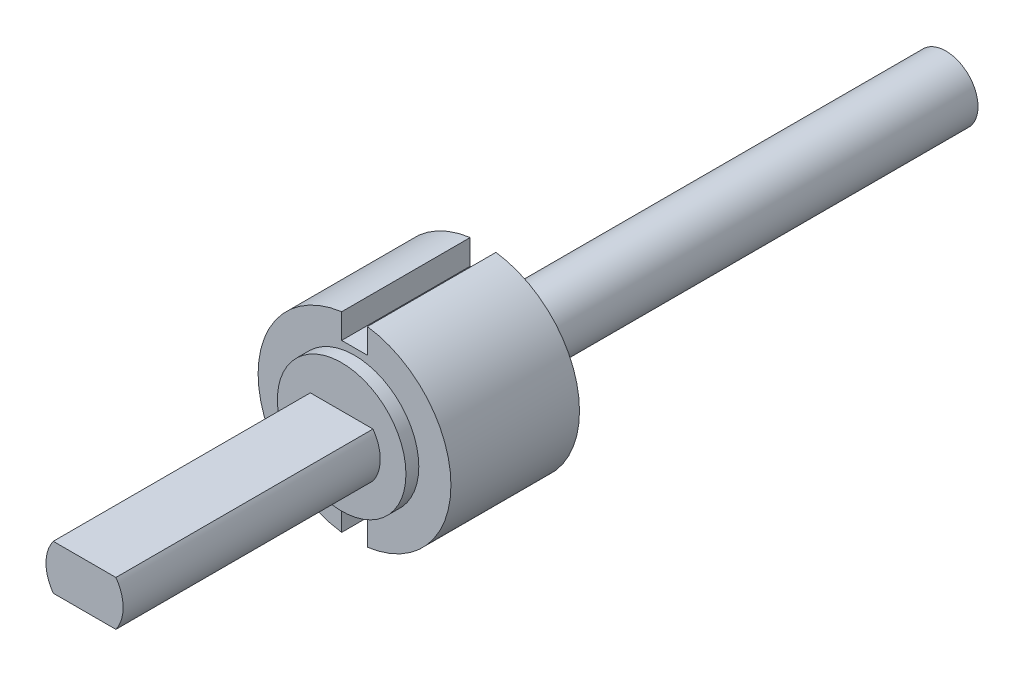
ISO-10303-21;
HEADER;
FILE_DESCRIPTION(('STEP AP214'),'2;1');
FILE_NAME('part.step','',(''),(''),'','','');
FILE_SCHEMA(('AUTOMOTIVE_DESIGN { 1 0 10303 214 1 1 1 1 }'));
ENDSEC;
DATA;
#1=APPLICATION_CONTEXT('core data for automotive mechanical design processes');
#2=APPLICATION_PROTOCOL_DEFINITION('international standard','automotive_design',2000,#1);
#3=PRODUCT_CONTEXT('',#1,'mechanical');
#4=PRODUCT('Part','Part','',(#3));
#5=PRODUCT_RELATED_PRODUCT_CATEGORY('part','',(#4));
#6=PRODUCT_DEFINITION_FORMATION('','',#4);
#7=PRODUCT_DEFINITION_CONTEXT('part definition',#1,'design');
#8=PRODUCT_DEFINITION('design','',#6,#7);
#9=PRODUCT_DEFINITION_SHAPE('','',#8);
#10=(LENGTH_UNIT() NAMED_UNIT(*) SI_UNIT(.MILLI.,.METRE.));
#11=(NAMED_UNIT(*) PLANE_ANGLE_UNIT() SI_UNIT($,.RADIAN.));
#12=(NAMED_UNIT(*) SI_UNIT($,.STERADIAN.) SOLID_ANGLE_UNIT());
#13=UNCERTAINTY_MEASURE_WITH_UNIT(LENGTH_MEASURE(1.E-05),#10,'distance_accuracy_value','');
#14=(GEOMETRIC_REPRESENTATION_CONTEXT(3) GLOBAL_UNCERTAINTY_ASSIGNED_CONTEXT((#13)) GLOBAL_UNIT_ASSIGNED_CONTEXT((#10,
#11,#12)) REPRESENTATION_CONTEXT('',''));
#15=CARTESIAN_POINT('',(0.,0.,0.));
#16=DIRECTION('',(0.,0.,1.));
#17=DIRECTION('',(1.,0.,0.));
#18=AXIS2_PLACEMENT_3D('',#15,#16,#17);
#19=CARTESIAN_POINT('',(0.,0.,5.));
#20=DIRECTION('',(0.,0.,-1.));
#21=DIRECTION('',(-1.,0.,0.));
#22=AXIS2_PLACEMENT_3D('',#19,#20,#21);
#23=CYLINDRICAL_SURFACE('',#22,7.5);
#24=CARTESIAN_POINT('',(0.,0.,5.));
#25=DIRECTION('',(0.,0.,1.));
#26=DIRECTION('',(1.,0.,0.));
#27=AXIS2_PLACEMENT_3D('',#24,#25,#26);
#28=CIRCLE('',#27,7.5);
#29=CARTESIAN_POINT('',(1.,-7.43303437365925,5.));
#30=VERTEX_POINT('',#29);
#31=CARTESIAN_POINT('',(1.,7.43303437365925,5.));
#32=VERTEX_POINT('',#31);
#33=EDGE_CURVE('E152',#30,#32,#28,.T.);
#34=ORIENTED_EDGE('',*,*,#33,.F.);
#35=DIRECTION('',(0.,0.,-1.));
#36=VECTOR('',#35,1.);
#37=CARTESIAN_POINT('',(1.,-7.43303437365925,5.));
#38=LINE('',#37,#36);
#39=CARTESIAN_POINT('',(1.,-7.43303437365925,-5.));
#40=VERTEX_POINT('',#39);
#41=EDGE_CURVE('E233',#30,#40,#38,.T.);
#42=ORIENTED_EDGE('',*,*,#41,.T.);
#43=CARTESIAN_POINT('',(0.,0.,-5.));
#44=DIRECTION('',(0.,0.,1.));
#45=DIRECTION('',(1.,0.,0.));
#46=AXIS2_PLACEMENT_3D('',#43,#44,#45);
#47=CIRCLE('',#46,7.5);
#48=CARTESIAN_POINT('',(1.,7.43303437365925,-5.));
#49=VERTEX_POINT('',#48);
#50=EDGE_CURVE('E144',#40,#49,#47,.T.);
#51=ORIENTED_EDGE('',*,*,#50,.T.);
#52=DIRECTION('',(0.,0.,-1.));
#53=VECTOR('',#52,1.);
#54=CARTESIAN_POINT('',(1.,7.43303437365925,5.));
#55=LINE('',#54,#53);
#56=EDGE_CURVE('E178',#49,#32,#55,.F.);
#57=ORIENTED_EDGE('',*,*,#56,.T.);
#58=EDGE_LOOP('',(#34,#42,#51,#57));
#59=FACE_BOUND('',#58,.T.);
#60=ADVANCED_FACE('F35',(#59),#23,.T.);
#61=CARTESIAN_POINT('',(0.,0.,6.));
#62=DIRECTION('',(0.,0.,1.));
#63=DIRECTION('',(1.,0.,0.));
#64=AXIS2_PLACEMENT_3D('',#61,#62,#63);
#65=PLANE('',#64);
#66=CARTESIAN_POINT('',(0.,0.,6.));
#67=DIRECTION('',(0.,0.,1.));
#68=DIRECTION('',(1.,0.,0.));
#69=AXIS2_PLACEMENT_3D('',#66,#67,#68);
#70=CIRCLE('',#69,5.);
#71=CARTESIAN_POINT('',(5.,0.,6.));
#72=VERTEX_POINT('',#71);
#73=EDGE_CURVE('E149',#72,#72,#70,.T.);
#74=ORIENTED_EDGE('',*,*,#73,.T.);
#75=EDGE_LOOP('',(#74));
#76=FACE_BOUND('',#75,.T.);
#77=DIRECTION('',(1.,0.,0.));
#78=VECTOR('',#77,1.);
#79=CARTESIAN_POINT('',(0.,1.75,6.));
#80=LINE('',#79,#78);
#81=CARTESIAN_POINT('',(-2.43669858620224,1.75,6.));
#82=VERTEX_POINT('',#81);
#83=CARTESIAN_POINT('',(2.43669858620224,1.75,6.));
#84=VERTEX_POINT('',#83);
#85=EDGE_CURVE('E181',#82,#84,#80,.T.);
#86=ORIENTED_EDGE('',*,*,#85,.T.);
#87=CARTESIAN_POINT('',(0.,0.,6.));
#88=DIRECTION('',(0.,0.,1.));
#89=DIRECTION('',(1.,0.,0.));
#90=AXIS2_PLACEMENT_3D('',#87,#88,#89);
#91=CIRCLE('',#90,3.);
#92=CARTESIAN_POINT('',(2.43669858620224,-1.75,6.));
#93=VERTEX_POINT('',#92);
#94=EDGE_CURVE('E191',#93,#84,#91,.T.);
#95=ORIENTED_EDGE('',*,*,#94,.F.);
#96=DIRECTION('',(1.,0.,0.));
#97=VECTOR('',#96,1.);
#98=CARTESIAN_POINT('',(0.,-1.75,6.));
#99=LINE('',#98,#97);
#100=CARTESIAN_POINT('',(-2.43669858620224,-1.75,6.));
#101=VERTEX_POINT('',#100);
#102=EDGE_CURVE('E200',#101,#93,#99,.T.);
#103=ORIENTED_EDGE('',*,*,#102,.F.);
#104=EDGE_CURVE('E198',#82,#101,#91,.T.);
#105=ORIENTED_EDGE('',*,*,#104,.F.);
#106=EDGE_LOOP('',(#86,#95,#103,#105));
#107=FACE_BOUND('',#106,.T.);
#108=ADVANCED_FACE('F224',(#76,#107),#65,.T.);
#109=CARTESIAN_POINT('',(-1.,7.43303437365925,-5.));
#110=VERTEX_POINT('',#109);
#111=CARTESIAN_POINT('',(-0.999999999999999,-7.43303437365925,-5.));
#112=VERTEX_POINT('',#111);
#113=EDGE_CURVE('E148',#110,#112,#47,.T.);
#114=ORIENTED_EDGE('',*,*,#113,.T.);
#115=DIRECTION('',(0.,0.,-1.));
#116=VECTOR('',#115,1.);
#117=CARTESIAN_POINT('',(-0.999999999999999,-7.43303437365925,5.));
#118=LINE('',#117,#116);
#119=CARTESIAN_POINT('',(-0.999999999999999,-7.43303437365925,5.));
#120=VERTEX_POINT('',#119);
#121=EDGE_CURVE('E244',#112,#120,#118,.F.);
#122=ORIENTED_EDGE('',*,*,#121,.T.);
#123=CARTESIAN_POINT('',(-1.,7.43303437365925,5.));
#124=VERTEX_POINT('',#123);
#125=EDGE_CURVE('E158',#124,#120,#28,.T.);
#126=ORIENTED_EDGE('',*,*,#125,.F.);
#127=DIRECTION('',(0.,0.,-1.));
#128=VECTOR('',#127,1.);
#129=CARTESIAN_POINT('',(-1.,7.43303437365925,5.));
#130=LINE('',#129,#128);
#131=EDGE_CURVE('E169',#124,#110,#130,.T.);
#132=ORIENTED_EDGE('',*,*,#131,.T.);
#133=EDGE_LOOP('',(#114,#122,#126,#132));
#134=FACE_BOUND('',#133,.T.);
#135=ADVANCED_FACE('F37',(#134),#23,.T.);
#136=CARTESIAN_POINT('',(0.,0.,5.));
#137=DIRECTION('',(0.,0.,1.));
#138=DIRECTION('',(1.,0.,0.));
#139=AXIS2_PLACEMENT_3D('',#136,#137,#138);
#140=PLANE('',#139);
#141=DIRECTION('',(0.,1.,0.));
#142=VECTOR('',#141,1.);
#143=CARTESIAN_POINT('',(1.,-7.5,5.));
#144=LINE('',#143,#142);
#145=CARTESIAN_POINT('',(1.,-5.5,5.));
#146=VERTEX_POINT('',#145);
#147=EDGE_CURVE('E129',#30,#146,#144,.T.);
#148=ORIENTED_EDGE('',*,*,#147,.F.);
#149=ORIENTED_EDGE('',*,*,#33,.T.);
#150=DIRECTION('',(0.,1.,0.));
#151=VECTOR('',#150,1.);
#152=CARTESIAN_POINT('',(1.,7.5,5.));
#153=LINE('',#152,#151);
#154=CARTESIAN_POINT('',(0.999999999999999,5.5,5.));
#155=VERTEX_POINT('',#154);
#156=EDGE_CURVE('E242',#155,#32,#153,.T.);
#157=ORIENTED_EDGE('',*,*,#156,.F.);
#158=DIRECTION('',(1.,0.,0.));
#159=VECTOR('',#158,1.);
#160=CARTESIAN_POINT('',(-1.,5.5,5.));
#161=LINE('',#160,#159);
#162=CARTESIAN_POINT('',(-1.,5.5,5.));
#163=VERTEX_POINT('',#162);
#164=EDGE_CURVE('E240',#163,#155,#161,.T.);
#165=ORIENTED_EDGE('',*,*,#164,.F.);
#166=DIRECTION('',(0.,-1.,0.));
#167=VECTOR('',#166,1.);
#168=CARTESIAN_POINT('',(-1.,7.5,5.));
#169=LINE('',#168,#167);
#170=EDGE_CURVE('E238',#124,#163,#169,.T.);
#171=ORIENTED_EDGE('',*,*,#170,.F.);
#172=ORIENTED_EDGE('',*,*,#125,.T.);
#173=DIRECTION('',(0.,-1.,0.));
#174=VECTOR('',#173,1.);
#175=CARTESIAN_POINT('',(-0.999999999999999,-7.5,5.));
#176=LINE('',#175,#174);
#177=CARTESIAN_POINT('',(-0.999999999999999,-5.5,5.));
#178=VERTEX_POINT('',#177);
#179=EDGE_CURVE('E139',#178,#120,#176,.T.);
#180=ORIENTED_EDGE('',*,*,#179,.F.);
#181=DIRECTION('',(-1.,0.,0.));
#182=VECTOR('',#181,1.);
#183=CARTESIAN_POINT('',(1.,-5.5,5.));
#184=LINE('',#183,#182);
#185=EDGE_CURVE('E255',#146,#178,#184,.T.);
#186=ORIENTED_EDGE('',*,*,#185,.F.);
#187=EDGE_LOOP('',(#148,#149,#157,#165,#171,#172,#180,#186));
#188=FACE_BOUND('',#187,.T.);
#189=CARTESIAN_POINT('',(0.,0.,5.));
#190=DIRECTION('',(0.,0.,1.));
#191=DIRECTION('',(1.,0.,0.));
#192=AXIS2_PLACEMENT_3D('',#189,#190,#191);
#193=CIRCLE('',#192,5.);
#194=CARTESIAN_POINT('',(5.,0.,5.));
#195=VERTEX_POINT('',#194);
#196=EDGE_CURVE('E154',#195,#195,#193,.T.);
#197=ORIENTED_EDGE('',*,*,#196,.F.);
#198=EDGE_LOOP('',(#197));
#199=FACE_BOUND('',#198,.T.);
#200=ADVANCED_FACE('F216',(#188,#199),#140,.T.);
#201=CARTESIAN_POINT('',(0.,0.,-5.));
#202=DIRECTION('',(0.,0.,1.));
#203=DIRECTION('',(1.,0.,0.));
#204=AXIS2_PLACEMENT_3D('',#201,#202,#203);
#205=PLANE('',#204);
#206=ORIENTED_EDGE('',*,*,#50,.F.);
#207=DIRECTION('',(0.,1.,0.));
#208=VECTOR('',#207,1.);
#209=CARTESIAN_POINT('',(1.,0.,-5.));
#210=LINE('',#209,#208);
#211=CARTESIAN_POINT('',(1.,-5.5,-5.));
#212=VERTEX_POINT('',#211);
#213=EDGE_CURVE('E11',#40,#212,#210,.T.);
#214=ORIENTED_EDGE('',*,*,#213,.T.);
#215=DIRECTION('',(-1.,0.,0.));
#216=VECTOR('',#215,1.);
#217=CARTESIAN_POINT('',(1.,-5.5,-5.));
#218=LINE('',#217,#216);
#219=CARTESIAN_POINT('',(-0.999999999999999,-5.5,-5.));
#220=VERTEX_POINT('',#219);
#221=EDGE_CURVE('E136',#212,#220,#218,.T.);
#222=ORIENTED_EDGE('',*,*,#221,.T.);
#223=DIRECTION('',(0.,-1.,0.));
#224=VECTOR('',#223,1.);
#225=CARTESIAN_POINT('',(-0.999999999999999,-7.5,-5.));
#226=LINE('',#225,#224);
#227=EDGE_CURVE('E50',#220,#112,#226,.T.);
#228=ORIENTED_EDGE('',*,*,#227,.T.);
#229=ORIENTED_EDGE('',*,*,#113,.F.);
#230=DIRECTION('',(0.,-1.,0.));
#231=VECTOR('',#230,1.);
#232=CARTESIAN_POINT('',(-1.,0.,-5.));
#233=LINE('',#232,#231);
#234=CARTESIAN_POINT('',(-1.,5.5,-5.));
#235=VERTEX_POINT('',#234);
#236=EDGE_CURVE('E43',#110,#235,#233,.T.);
#237=ORIENTED_EDGE('',*,*,#236,.T.);
#238=DIRECTION('',(1.,0.,0.));
#239=VECTOR('',#238,1.);
#240=CARTESIAN_POINT('',(-1.,5.5,-5.));
#241=LINE('',#240,#239);
#242=CARTESIAN_POINT('',(0.999999999999999,5.5,-5.));
#243=VERTEX_POINT('',#242);
#244=EDGE_CURVE('E165',#235,#243,#241,.T.);
#245=ORIENTED_EDGE('',*,*,#244,.T.);
#246=DIRECTION('',(0.,1.,0.));
#247=VECTOR('',#246,1.);
#248=CARTESIAN_POINT('',(1.,7.5,-5.));
#249=LINE('',#248,#247);
#250=EDGE_CURVE('E58',#243,#49,#249,.T.);
#251=ORIENTED_EDGE('',*,*,#250,.T.);
#252=EDGE_LOOP('',(#206,#214,#222,#228,#229,#237,#245,#251));
#253=FACE_BOUND('',#252,.T.);
#254=CARTESIAN_POINT('',(0.,0.,-5.));
#255=DIRECTION('',(0.,0.,1.));
#256=DIRECTION('',(1.,0.,0.));
#257=AXIS2_PLACEMENT_3D('',#254,#255,#256);
#258=CIRCLE('',#257,2.5);
#259=CARTESIAN_POINT('',(2.5,0.,-5.));
#260=VERTEX_POINT('',#259);
#261=EDGE_CURVE('E160',#260,#260,#258,.F.);
#262=ORIENTED_EDGE('',*,*,#261,.F.);
#263=EDGE_LOOP('',(#262));
#264=FACE_BOUND('',#263,.T.);
#265=ADVANCED_FACE('F142',(#253,#264),#205,.F.);
#266=CARTESIAN_POINT('',(0.,0.,6.));
#267=DIRECTION('',(0.,0.,-1.));
#268=DIRECTION('',(-1.,0.,0.));
#269=AXIS2_PLACEMENT_3D('',#266,#267,#268);
#270=CYLINDRICAL_SURFACE('',#269,5.);
#271=ORIENTED_EDGE('',*,*,#73,.F.);
#272=EDGE_LOOP('',(#271));
#273=FACE_BOUND('',#272,.T.);
#274=ORIENTED_EDGE('',*,*,#196,.T.);
#275=EDGE_LOOP('',(#274));
#276=FACE_BOUND('',#275,.T.);
#277=ADVANCED_FACE('F214',(#273,#276),#270,.T.);
#278=CARTESIAN_POINT('',(0.,1.75,26.));
#279=DIRECTION('',(0.,1.,0.));
#280=DIRECTION('',(0.,0.,1.));
#281=AXIS2_PLACEMENT_3D('',#278,#279,#280);
#282=PLANE('',#281);
#283=ORIENTED_EDGE('',*,*,#85,.F.);
#284=DIRECTION('',(0.,0.,-1.));
#285=VECTOR('',#284,1.);
#286=CARTESIAN_POINT('',(-2.43669858620224,1.75,26.));
#287=LINE('',#286,#285);
#288=CARTESIAN_POINT('',(-2.43669858620224,1.75,26.));
#289=VERTEX_POINT('',#288);
#290=EDGE_CURVE('E210',#289,#82,#287,.T.);
#291=ORIENTED_EDGE('',*,*,#290,.F.);
#292=DIRECTION('',(1.,0.,0.));
#293=VECTOR('',#292,1.);
#294=CARTESIAN_POINT('',(0.,1.75,26.));
#295=LINE('',#294,#293);
#296=CARTESIAN_POINT('',(2.43669858620224,1.75,26.));
#297=VERTEX_POINT('',#296);
#298=EDGE_CURVE('E187',#289,#297,#295,.T.);
#299=ORIENTED_EDGE('',*,*,#298,.T.);
#300=DIRECTION('',(0.,0.,-1.));
#301=VECTOR('',#300,1.);
#302=CARTESIAN_POINT('',(2.43669858620224,1.75,26.));
#303=LINE('',#302,#301);
#304=EDGE_CURVE('E203',#297,#84,#303,.T.);
#305=ORIENTED_EDGE('',*,*,#304,.T.);
#306=EDGE_LOOP('',(#283,#291,#299,#305));
#307=FACE_BOUND('',#306,.T.);
#308=ADVANCED_FACE('F297',(#307),#282,.T.);
#309=CARTESIAN_POINT('',(0.,0.,26.));
#310=DIRECTION('',(0.,0.,-1.));
#311=DIRECTION('',(-1.,0.,0.));
#312=AXIS2_PLACEMENT_3D('',#309,#310,#311);
#313=CYLINDRICAL_SURFACE('',#312,3.);
#314=ORIENTED_EDGE('',*,*,#104,.T.);
#315=DIRECTION('',(0.,0.,-1.));
#316=VECTOR('',#315,1.);
#317=CARTESIAN_POINT('',(-2.43669858620224,-1.75,26.));
#318=LINE('',#317,#316);
#319=CARTESIAN_POINT('',(-2.43669858620224,-1.75,26.));
#320=VERTEX_POINT('',#319);
#321=EDGE_CURVE('E207',#320,#101,#318,.T.);
#322=ORIENTED_EDGE('',*,*,#321,.F.);
#323=CARTESIAN_POINT('',(0.,0.,26.));
#324=DIRECTION('',(0.,0.,1.));
#325=DIRECTION('',(1.,0.,0.));
#326=AXIS2_PLACEMENT_3D('',#323,#324,#325);
#327=CIRCLE('',#326,3.);
#328=EDGE_CURVE('E190',#289,#320,#327,.T.);
#329=ORIENTED_EDGE('',*,*,#328,.F.);
#330=ORIENTED_EDGE('',*,*,#290,.T.);
#331=EDGE_LOOP('',(#314,#322,#329,#330));
#332=FACE_BOUND('',#331,.T.);
#333=ADVANCED_FACE('F293',(#332),#313,.T.);
#334=CARTESIAN_POINT('',(0.,-1.75,26.));
#335=DIRECTION('',(0.,1.,0.));
#336=DIRECTION('',(0.,0.,1.));
#337=AXIS2_PLACEMENT_3D('',#334,#335,#336);
#338=PLANE('',#337);
#339=ORIENTED_EDGE('',*,*,#102,.T.);
#340=DIRECTION('',(0.,0.,-1.));
#341=VECTOR('',#340,1.);
#342=CARTESIAN_POINT('',(2.43669858620224,-1.75,26.));
#343=LINE('',#342,#341);
#344=CARTESIAN_POINT('',(2.43669858620224,-1.75,26.));
#345=VERTEX_POINT('',#344);
#346=EDGE_CURVE('E205',#345,#93,#343,.T.);
#347=ORIENTED_EDGE('',*,*,#346,.F.);
#348=DIRECTION('',(1.,0.,0.));
#349=VECTOR('',#348,1.);
#350=CARTESIAN_POINT('',(0.,-1.75,26.));
#351=LINE('',#350,#349);
#352=EDGE_CURVE('E193',#320,#345,#351,.T.);
#353=ORIENTED_EDGE('',*,*,#352,.F.);
#354=ORIENTED_EDGE('',*,*,#321,.T.);
#355=EDGE_LOOP('',(#339,#347,#353,#354));
#356=FACE_BOUND('',#355,.T.);
#357=ADVANCED_FACE('F291',(#356),#338,.F.);
#358=ORIENTED_EDGE('',*,*,#94,.T.);
#359=ORIENTED_EDGE('',*,*,#304,.F.);
#360=EDGE_CURVE('E194',#345,#297,#327,.T.);
#361=ORIENTED_EDGE('',*,*,#360,.F.);
#362=ORIENTED_EDGE('',*,*,#346,.T.);
#363=EDGE_LOOP('',(#358,#359,#361,#362));
#364=FACE_BOUND('',#363,.T.);
#365=ADVANCED_FACE('F287',(#364),#313,.T.);
#366=CARTESIAN_POINT('',(0.,0.,26.));
#367=DIRECTION('',(0.,0.,1.));
#368=DIRECTION('',(1.,0.,0.));
#369=AXIS2_PLACEMENT_3D('',#366,#367,#368);
#370=PLANE('',#369);
#371=ORIENTED_EDGE('',*,*,#298,.F.);
#372=ORIENTED_EDGE('',*,*,#328,.T.);
#373=ORIENTED_EDGE('',*,*,#352,.T.);
#374=ORIENTED_EDGE('',*,*,#360,.T.);
#375=EDGE_LOOP('',(#371,#372,#373,#374));
#376=FACE_BOUND('',#375,.T.);
#377=ADVANCED_FACE('F283',(#376),#370,.T.);
#378=CARTESIAN_POINT('',(0.,0.,-41.));
#379=DIRECTION('',(0.,0.,1.));
#380=DIRECTION('',(1.,0.,0.));
#381=AXIS2_PLACEMENT_3D('',#378,#379,#380);
#382=CYLINDRICAL_SURFACE('',#381,2.5);
#383=CARTESIAN_POINT('',(0.,0.,-41.));
#384=DIRECTION('',(0.,0.,-1.));
#385=DIRECTION('',(-1.,0.,0.));
#386=AXIS2_PLACEMENT_3D('',#383,#384,#385);
#387=CIRCLE('',#386,2.5);
#388=CARTESIAN_POINT('',(-2.5,0.,-41.));
#389=VERTEX_POINT('',#388);
#390=EDGE_CURVE('E177',#389,#389,#387,.T.);
#391=ORIENTED_EDGE('',*,*,#390,.F.);
#392=EDGE_LOOP('',(#391));
#393=FACE_BOUND('',#392,.T.);
#394=ORIENTED_EDGE('',*,*,#261,.T.);
#395=EDGE_LOOP('',(#394));
#396=FACE_BOUND('',#395,.T.);
#397=ADVANCED_FACE('F279',(#393,#396),#382,.T.);
#398=CARTESIAN_POINT('',(0.,0.,-41.));
#399=DIRECTION('',(0.,0.,-1.));
#400=DIRECTION('',(-1.,0.,0.));
#401=AXIS2_PLACEMENT_3D('',#398,#399,#400);
#402=PLANE('',#401);
#403=ORIENTED_EDGE('',*,*,#390,.T.);
#404=EDGE_LOOP('',(#403));
#405=FACE_BOUND('',#404,.T.);
#406=ADVANCED_FACE('F276',(#405),#402,.T.);
#407=CARTESIAN_POINT('',(-1.,7.5,-5.));
#408=DIRECTION('',(-1.,0.,0.));
#409=DIRECTION('',(0.,0.,1.));
#410=AXIS2_PLACEMENT_3D('',#407,#408,#409);
#411=PLANE('',#410);
#412=ORIENTED_EDGE('',*,*,#170,.T.);
#413=DIRECTION('',(0.,0.,1.));
#414=VECTOR('',#413,1.);
#415=CARTESIAN_POINT('',(-1.,5.5,-5.));
#416=LINE('',#415,#414);
#417=EDGE_CURVE('E172',#235,#163,#416,.T.);
#418=ORIENTED_EDGE('',*,*,#417,.F.);
#419=ORIENTED_EDGE('',*,*,#236,.F.);
#420=ORIENTED_EDGE('',*,*,#131,.F.);
#421=EDGE_LOOP('',(#412,#418,#419,#420));
#422=FACE_BOUND('',#421,.T.);
#423=ADVANCED_FACE('F168',(#422),#411,.F.);
#424=CARTESIAN_POINT('',(1.,7.5,-5.));
#425=DIRECTION('',(1.,0.,0.));
#426=DIRECTION('',(0.,1.,0.));
#427=AXIS2_PLACEMENT_3D('',#424,#425,#426);
#428=PLANE('',#427);
#429=ORIENTED_EDGE('',*,*,#250,.F.);
#430=DIRECTION('',(0.,0.,1.));
#431=VECTOR('',#430,1.);
#432=CARTESIAN_POINT('',(0.999999999999999,5.5,-5.));
#433=LINE('',#432,#431);
#434=EDGE_CURVE('E183',#243,#155,#433,.T.);
#435=ORIENTED_EDGE('',*,*,#434,.T.);
#436=ORIENTED_EDGE('',*,*,#156,.T.);
#437=ORIENTED_EDGE('',*,*,#56,.F.);
#438=EDGE_LOOP('',(#429,#435,#436,#437));
#439=FACE_BOUND('',#438,.T.);
#440=ADVANCED_FACE('F269',(#439),#428,.F.);
#441=CARTESIAN_POINT('',(-1.,5.5,-5.));
#442=DIRECTION('',(0.,-1.,0.));
#443=DIRECTION('',(1.,0.,0.));
#444=AXIS2_PLACEMENT_3D('',#441,#442,#443);
#445=PLANE('',#444);
#446=ORIENTED_EDGE('',*,*,#164,.T.);
#447=ORIENTED_EDGE('',*,*,#434,.F.);
#448=ORIENTED_EDGE('',*,*,#244,.F.);
#449=ORIENTED_EDGE('',*,*,#417,.T.);
#450=EDGE_LOOP('',(#446,#447,#448,#449));
#451=FACE_BOUND('',#450,.T.);
#452=ADVANCED_FACE('F266',(#451),#445,.F.);
#453=CARTESIAN_POINT('',(1.,-7.5,-5.));
#454=DIRECTION('',(1.,0.,0.));
#455=DIRECTION('',(0.,1.,0.));
#456=AXIS2_PLACEMENT_3D('',#453,#454,#455);
#457=PLANE('',#456);
#458=ORIENTED_EDGE('',*,*,#147,.T.);
#459=DIRECTION('',(0.,0.,1.));
#460=VECTOR('',#459,1.);
#461=CARTESIAN_POINT('',(1.,-5.5,-5.));
#462=LINE('',#461,#460);
#463=EDGE_CURVE('E124',#212,#146,#462,.T.);
#464=ORIENTED_EDGE('',*,*,#463,.F.);
#465=ORIENTED_EDGE('',*,*,#213,.F.);
#466=ORIENTED_EDGE('',*,*,#41,.F.);
#467=EDGE_LOOP('',(#458,#464,#465,#466));
#468=FACE_BOUND('',#467,.T.);
#469=ADVANCED_FACE('F126',(#468),#457,.F.);
#470=CARTESIAN_POINT('',(-0.999999999999999,-7.5,-5.));
#471=DIRECTION('',(-1.,0.,0.));
#472=DIRECTION('',(0.,0.,1.));
#473=AXIS2_PLACEMENT_3D('',#470,#471,#472);
#474=PLANE('',#473);
#475=ORIENTED_EDGE('',*,*,#227,.F.);
#476=DIRECTION('',(0.,0.,1.));
#477=VECTOR('',#476,1.);
#478=CARTESIAN_POINT('',(-0.999999999999999,-5.5,-5.));
#479=LINE('',#478,#477);
#480=EDGE_CURVE('E133',#220,#178,#479,.T.);
#481=ORIENTED_EDGE('',*,*,#480,.T.);
#482=ORIENTED_EDGE('',*,*,#179,.T.);
#483=ORIENTED_EDGE('',*,*,#121,.F.);
#484=EDGE_LOOP('',(#475,#481,#482,#483));
#485=FACE_BOUND('',#484,.T.);
#486=ADVANCED_FACE('F258',(#485),#474,.F.);
#487=CARTESIAN_POINT('',(1.,-5.5,-5.));
#488=DIRECTION('',(0.,1.,0.));
#489=DIRECTION('',(0.,0.,1.));
#490=AXIS2_PLACEMENT_3D('',#487,#488,#489);
#491=PLANE('',#490);
#492=ORIENTED_EDGE('',*,*,#185,.T.);
#493=ORIENTED_EDGE('',*,*,#480,.F.);
#494=ORIENTED_EDGE('',*,*,#221,.F.);
#495=ORIENTED_EDGE('',*,*,#463,.T.);
#496=EDGE_LOOP('',(#492,#493,#494,#495));
#497=FACE_BOUND('',#496,.T.);
#498=ADVANCED_FACE('F137',(#497),#491,.F.);
#499=CLOSED_SHELL('',(#60,#108,#135,#200,#265,#277,#308,#333,#357,#365,#377,#397,#406,#423,#440,
#452,#469,#486,#498));
#500=MANIFOLD_SOLID_BREP('B2',#499);
#501=ADVANCED_BREP_SHAPE_REPRESENTATION('',(#18,#500),#14);
#502=SHAPE_DEFINITION_REPRESENTATION(#9,#501);
ENDSEC;
END-ISO-10303-21;
